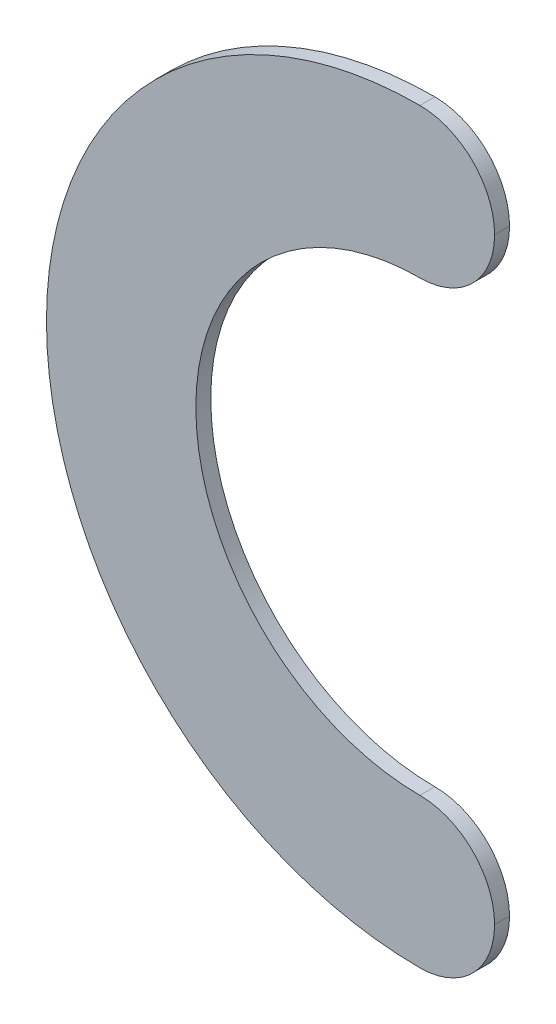
ISO-10303-21;
HEADER;
FILE_DESCRIPTION(('STEP AP214'),'2;1');
FILE_NAME('part.step','',(''),(''),'','','');
FILE_SCHEMA(('AUTOMOTIVE_DESIGN { 1 0 10303 214 1 1 1 1 }'));
ENDSEC;
DATA;
#1=APPLICATION_CONTEXT('core data for automotive mechanical design processes');
#2=APPLICATION_PROTOCOL_DEFINITION('international standard','automotive_design',2000,#1);
#3=PRODUCT_CONTEXT('',#1,'mechanical');
#4=PRODUCT('Part','Part','',(#3));
#5=PRODUCT_RELATED_PRODUCT_CATEGORY('part','',(#4));
#6=PRODUCT_DEFINITION_FORMATION('','',#4);
#7=PRODUCT_DEFINITION_CONTEXT('part definition',#1,'design');
#8=PRODUCT_DEFINITION('design','',#6,#7);
#9=PRODUCT_DEFINITION_SHAPE('','',#8);
#10=(LENGTH_UNIT() NAMED_UNIT(*) SI_UNIT(.MILLI.,.METRE.));
#11=(NAMED_UNIT(*) PLANE_ANGLE_UNIT() SI_UNIT($,.RADIAN.));
#12=(NAMED_UNIT(*) SI_UNIT($,.STERADIAN.) SOLID_ANGLE_UNIT());
#13=UNCERTAINTY_MEASURE_WITH_UNIT(LENGTH_MEASURE(1.E-05),#10,'distance_accuracy_value','');
#14=(GEOMETRIC_REPRESENTATION_CONTEXT(3) GLOBAL_UNCERTAINTY_ASSIGNED_CONTEXT((#13)) GLOBAL_UNIT_ASSIGNED_CONTEXT((#10,
#11,#12)) REPRESENTATION_CONTEXT('',''));
#15=CARTESIAN_POINT('',(0.,0.,0.));
#16=DIRECTION('',(0.,0.,1.));
#17=DIRECTION('',(1.,0.,0.));
#18=AXIS2_PLACEMENT_3D('',#15,#16,#17);
#19=CARTESIAN_POINT('',(16.310367265671,36.653999023438,0.0127));
#20=DIRECTION('',(0.,0.,1.));
#21=DIRECTION('',(1.,0.,0.));
#22=AXIS2_PLACEMENT_3D('',#19,#20,#21);
#23=PLANE('',#22);
#24=CARTESIAN_POINT('',(16.426999511719,36.653999023438,0.0127));
#25=DIRECTION('',(0.,0.,-1.));
#26=DIRECTION('',(1.,0.,0.));
#27=AXIS2_PLACEMENT_3D('',#24,#25,#26);
#28=CIRCLE('',#27,0.3175);
#29=CARTESIAN_POINT('',(16.426999511726,36.336499023438,0.0127));
#30=VERTEX_POINT('',#29);
#31=CARTESIAN_POINT('',(16.426999511726,36.971499023438,0.0127));
#32=VERTEX_POINT('',#31);
#33=EDGE_CURVE('E61',#30,#32,#28,.T.);
#34=ORIENTED_EDGE('',*,*,#33,.F.);
#35=CARTESIAN_POINT('',(16.426999511731,36.399998779297,0.0127));
#36=DIRECTION('',(0.,0.,-1.));
#37=DIRECTION('',(1.,0.,0.));
#38=AXIS2_PLACEMENT_3D('',#35,#36,#37);
#39=CIRCLE('',#38,0.06349975585938);
#40=CARTESIAN_POINT('',(16.49049926759,36.399998779297,0.0127));
#41=VERTEX_POINT('',#40);
#42=EDGE_CURVE('E136',#41,#30,#39,.T.);
#43=ORIENTED_EDGE('',*,*,#42,.F.);
#44=CARTESIAN_POINT('',(16.426999511731,36.399998779297,0.0127));
#45=DIRECTION('',(0.,0.,-1.));
#46=DIRECTION('',(1.,0.,0.));
#47=AXIS2_PLACEMENT_3D('',#44,#45,#46);
#48=CIRCLE('',#47,0.06349975585938);
#49=CARTESIAN_POINT('',(16.426999664311,36.463498535156,0.0127));
#50=VERTEX_POINT('',#49);
#51=EDGE_CURVE('E74',#50,#41,#48,.T.);
#52=ORIENTED_EDGE('',*,*,#51,.F.);
#53=CARTESIAN_POINT('',(16.427000732426,36.653999023438,0.0127));
#54=DIRECTION('',(0.,0.,-1.));
#55=DIRECTION('',(1.,0.,0.));
#56=AXIS2_PLACEMENT_3D('',#53,#54,#55);
#57=CIRCLE('',#56,0.190500488285);
#58=CARTESIAN_POINT('',(16.426999664311,36.844499511719,0.0127));
#59=VERTEX_POINT('',#58);
#60=EDGE_CURVE('E102',#50,#59,#57,.T.);
#61=ORIENTED_EDGE('',*,*,#60,.T.);
#62=CARTESIAN_POINT('',(16.426999511731,36.907999267578,0.0127));
#63=DIRECTION('',(0.,0.,-1.));
#64=DIRECTION('',(1.,0.,0.));
#65=AXIS2_PLACEMENT_3D('',#62,#63,#64);
#66=CIRCLE('',#65,0.06349975585938);
#67=CARTESIAN_POINT('',(16.49049926759,36.907999267578,0.0127));
#68=VERTEX_POINT('',#67);
#69=EDGE_CURVE('E127',#68,#59,#66,.T.);
#70=ORIENTED_EDGE('',*,*,#69,.F.);
#71=CARTESIAN_POINT('',(16.426999511731,36.907999267578,0.0127));
#72=DIRECTION('',(0.,0.,-1.));
#73=DIRECTION('',(1.,0.,0.));
#74=AXIS2_PLACEMENT_3D('',#71,#72,#73);
#75=CIRCLE('',#74,0.06349975585938);
#76=EDGE_CURVE('E11',#32,#68,#75,.T.);
#77=ORIENTED_EDGE('',*,*,#76,.F.);
#78=EDGE_LOOP('',(#34,#43,#52,#61,#70,#77));
#79=FACE_BOUND('',#78,.T.);
#80=ADVANCED_FACE('F17',(#79),#23,.T.);
#81=CARTESIAN_POINT('',(16.426999511731,36.907999267578,0.));
#82=DIRECTION('',(0.,0.,1.));
#83=DIRECTION('',(1.,0.,0.));
#84=AXIS2_PLACEMENT_3D('',#81,#82,#83);
#85=CYLINDRICAL_SURFACE('',#84,0.06349975585938);
#86=DIRECTION('',(0.,0.,1.));
#87=VECTOR('',#86,1.);
#88=CARTESIAN_POINT('',(16.49049926759,36.907999267578,0.));
#89=LINE('',#88,#87);
#90=CARTESIAN_POINT('',(16.49049926759,36.907999267578,0.));
#91=VERTEX_POINT('',#90);
#92=EDGE_CURVE('E132',#91,#68,#89,.T.);
#93=ORIENTED_EDGE('',*,*,#92,.F.);
#94=CARTESIAN_POINT('',(16.426999511731,36.907999267578,0.));
#95=DIRECTION('',(0.,0.,1.));
#96=DIRECTION('',(1.,0.,0.));
#97=AXIS2_PLACEMENT_3D('',#94,#95,#96);
#98=CIRCLE('',#97,0.06349975585938);
#99=CARTESIAN_POINT('',(16.426999511726,36.971499023438,0.));
#100=VERTEX_POINT('',#99);
#101=EDGE_CURVE('E115',#91,#100,#98,.T.);
#102=ORIENTED_EDGE('',*,*,#101,.T.);
#103=DIRECTION('',(0.,0.,-1.));
#104=VECTOR('',#103,1.);
#105=CARTESIAN_POINT('',(16.426999511719,36.971499023438,0.));
#106=LINE('',#105,#104);
#107=EDGE_CURVE('E28',#32,#100,#106,.T.);
#108=ORIENTED_EDGE('',*,*,#107,.F.);
#109=ORIENTED_EDGE('',*,*,#76,.T.);
#110=EDGE_LOOP('',(#93,#102,#108,#109));
#111=FACE_BOUND('',#110,.T.);
#112=ADVANCED_FACE('F161',(#111),#85,.T.);
#113=CARTESIAN_POINT('',(16.426999511719,36.653999023438,0.));
#114=DIRECTION('',(0.,0.,1.));
#115=DIRECTION('',(1.,0.,0.));
#116=AXIS2_PLACEMENT_3D('',#113,#114,#115);
#117=CYLINDRICAL_SURFACE('',#116,0.3175);
#118=CARTESIAN_POINT('',(16.426999511719,36.653999023438,0.));
#119=DIRECTION('',(0.,0.,1.));
#120=DIRECTION('',(1.,0.,0.));
#121=AXIS2_PLACEMENT_3D('',#118,#119,#120);
#122=CIRCLE('',#121,0.3175);
#123=CARTESIAN_POINT('',(16.426999511726,36.336499023438,0.));
#124=VERTEX_POINT('',#123);
#125=EDGE_CURVE('E122',#100,#124,#122,.T.);
#126=ORIENTED_EDGE('',*,*,#125,.T.);
#127=DIRECTION('',(0.,0.,-1.));
#128=VECTOR('',#127,1.);
#129=CARTESIAN_POINT('',(16.426999511719,36.336499023438,0.));
#130=LINE('',#129,#128);
#131=EDGE_CURVE('E133',#30,#124,#130,.T.);
#132=ORIENTED_EDGE('',*,*,#131,.F.);
#133=ORIENTED_EDGE('',*,*,#33,.T.);
#134=ORIENTED_EDGE('',*,*,#107,.T.);
#135=EDGE_LOOP('',(#126,#132,#133,#134));
#136=FACE_BOUND('',#135,.T.);
#137=ADVANCED_FACE('F229',(#136),#117,.T.);
#138=CARTESIAN_POINT('',(16.426999511731,36.399998779297,0.));
#139=DIRECTION('',(0.,0.,1.));
#140=DIRECTION('',(1.,0.,0.));
#141=AXIS2_PLACEMENT_3D('',#138,#139,#140);
#142=CYLINDRICAL_SURFACE('',#141,0.06349975585938);
#143=DIRECTION('',(0.,0.,1.));
#144=VECTOR('',#143,1.);
#145=CARTESIAN_POINT('',(16.49049926759,36.399998779297,0.));
#146=LINE('',#145,#144);
#147=CARTESIAN_POINT('',(16.49049926759,36.399998779297,0.));
#148=VERTEX_POINT('',#147);
#149=EDGE_CURVE('E107',#148,#41,#146,.T.);
#150=ORIENTED_EDGE('',*,*,#149,.F.);
#151=CARTESIAN_POINT('',(16.426999511731,36.399998779297,0.));
#152=DIRECTION('',(0.,0.,1.));
#153=DIRECTION('',(1.,0.,0.));
#154=AXIS2_PLACEMENT_3D('',#151,#152,#153);
#155=CIRCLE('',#154,0.06349975585938);
#156=CARTESIAN_POINT('',(16.426999664311,36.463498535155,0.));
#157=VERTEX_POINT('',#156);
#158=EDGE_CURVE('E21',#148,#157,#155,.T.);
#159=ORIENTED_EDGE('',*,*,#158,.T.);
#160=DIRECTION('',(0.,0.,1.));
#161=VECTOR('',#160,1.);
#162=CARTESIAN_POINT('',(16.426999511719,36.463498535156,0.));
#163=LINE('',#162,#161);
#164=EDGE_CURVE('E97',#157,#50,#163,.T.);
#165=ORIENTED_EDGE('',*,*,#164,.T.);
#166=ORIENTED_EDGE('',*,*,#51,.T.);
#167=EDGE_LOOP('',(#150,#159,#165,#166));
#168=FACE_BOUND('',#167,.T.);
#169=ADVANCED_FACE('F105',(#168),#142,.T.);
#170=CARTESIAN_POINT('',(16.427000732426,36.653999023438,0.));
#171=DIRECTION('',(0.,0.,1.));
#172=DIRECTION('',(1.,0.,0.));
#173=AXIS2_PLACEMENT_3D('',#170,#171,#172);
#174=CYLINDRICAL_SURFACE('',#173,0.190500488285);
#175=ORIENTED_EDGE('',*,*,#164,.F.);
#176=CARTESIAN_POINT('',(16.427000732426,36.653999023438,0.));
#177=DIRECTION('',(0.,0.,-1.));
#178=DIRECTION('',(1.,0.,0.));
#179=AXIS2_PLACEMENT_3D('',#176,#177,#178);
#180=CIRCLE('',#179,0.190500488285);
#181=CARTESIAN_POINT('',(16.426999664311,36.844499511719,0.));
#182=VERTEX_POINT('',#181);
#183=EDGE_CURVE('E100',#157,#182,#180,.T.);
#184=ORIENTED_EDGE('',*,*,#183,.T.);
#185=DIRECTION('',(0.,0.,-1.));
#186=VECTOR('',#185,1.);
#187=CARTESIAN_POINT('',(16.426999511719,36.844499511719,0.));
#188=LINE('',#187,#186);
#189=EDGE_CURVE('E131',#59,#182,#188,.T.);
#190=ORIENTED_EDGE('',*,*,#189,.F.);
#191=ORIENTED_EDGE('',*,*,#60,.F.);
#192=EDGE_LOOP('',(#175,#184,#190,#191));
#193=FACE_BOUND('',#192,.T.);
#194=ADVANCED_FACE('F98',(#193),#174,.F.);
#195=CARTESIAN_POINT('',(16.310367265671,36.653999023438,0.));
#196=DIRECTION('',(0.,0.,1.));
#197=DIRECTION('',(1.,0.,0.));
#198=AXIS2_PLACEMENT_3D('',#195,#196,#197);
#199=PLANE('',#198);
#200=CARTESIAN_POINT('',(16.426999511731,36.399998779297,0.));
#201=DIRECTION('',(0.,0.,1.));
#202=DIRECTION('',(1.,0.,0.));
#203=AXIS2_PLACEMENT_3D('',#200,#201,#202);
#204=CIRCLE('',#203,0.06349975585938);
#205=EDGE_CURVE('E140',#124,#148,#204,.T.);
#206=ORIENTED_EDGE('',*,*,#205,.F.);
#207=ORIENTED_EDGE('',*,*,#125,.F.);
#208=ORIENTED_EDGE('',*,*,#101,.F.);
#209=CARTESIAN_POINT('',(16.426999511731,36.907999267578,0.));
#210=DIRECTION('',(0.,0.,1.));
#211=DIRECTION('',(1.,0.,0.));
#212=AXIS2_PLACEMENT_3D('',#209,#210,#211);
#213=CIRCLE('',#212,0.06349975585938);
#214=EDGE_CURVE('E113',#182,#91,#213,.T.);
#215=ORIENTED_EDGE('',*,*,#214,.F.);
#216=ORIENTED_EDGE('',*,*,#183,.F.);
#217=ORIENTED_EDGE('',*,*,#158,.F.);
#218=EDGE_LOOP('',(#206,#207,#208,#215,#216,#217));
#219=FACE_BOUND('',#218,.T.);
#220=ADVANCED_FACE('F111',(#219),#199,.F.);
#221=CARTESIAN_POINT('',(16.426999511731,36.907999267578,0.));
#222=DIRECTION('',(0.,0.,1.));
#223=DIRECTION('',(1.,0.,0.));
#224=AXIS2_PLACEMENT_3D('',#221,#222,#223);
#225=CYLINDRICAL_SURFACE('',#224,0.06349975585938);
#226=ORIENTED_EDGE('',*,*,#214,.T.);
#227=ORIENTED_EDGE('',*,*,#92,.T.);
#228=ORIENTED_EDGE('',*,*,#69,.T.);
#229=ORIENTED_EDGE('',*,*,#189,.T.);
#230=EDGE_LOOP('',(#226,#227,#228,#229));
#231=FACE_BOUND('',#230,.T.);
#232=ADVANCED_FACE('F159',(#231),#225,.T.);
#233=CARTESIAN_POINT('',(16.426999511731,36.399998779297,0.));
#234=DIRECTION('',(0.,0.,1.));
#235=DIRECTION('',(1.,0.,0.));
#236=AXIS2_PLACEMENT_3D('',#233,#234,#235);
#237=CYLINDRICAL_SURFACE('',#236,0.06349975585938);
#238=ORIENTED_EDGE('',*,*,#205,.T.);
#239=ORIENTED_EDGE('',*,*,#149,.T.);
#240=ORIENTED_EDGE('',*,*,#42,.T.);
#241=ORIENTED_EDGE('',*,*,#131,.T.);
#242=EDGE_LOOP('',(#238,#239,#240,#241));
#243=FACE_BOUND('',#242,.T.);
#244=ADVANCED_FACE('F19',(#243),#237,.T.);
#245=CLOSED_SHELL('',(#80,#112,#137,#169,#194,#220,#232,#244));
#246=MANIFOLD_SOLID_BREP('B1',#245);
#247=ADVANCED_BREP_SHAPE_REPRESENTATION('',(#18,#246),#14);
#248=SHAPE_DEFINITION_REPRESENTATION(#9,#247);
ENDSEC;
END-ISO-10303-21;
